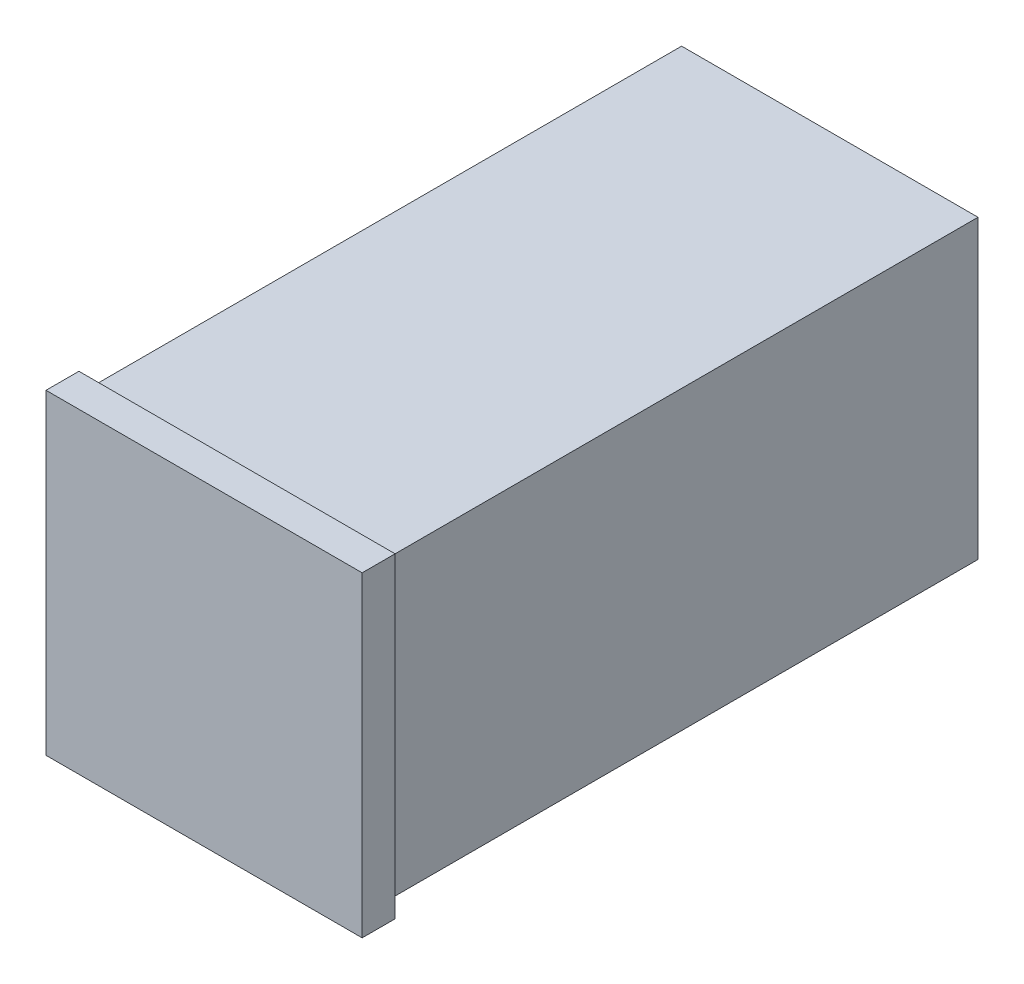
ISO-10303-21;
HEADER;
FILE_DESCRIPTION(('STEP AP214'),'2;1');
FILE_NAME('part.step','',(''),(''),'','','');
FILE_SCHEMA(('AUTOMOTIVE_DESIGN { 1 0 10303 214 1 1 1 1 }'));
ENDSEC;
DATA;
#1=APPLICATION_CONTEXT('core data for automotive mechanical design processes');
#2=APPLICATION_PROTOCOL_DEFINITION('international standard','automotive_design',2000,#1);
#3=PRODUCT_CONTEXT('',#1,'mechanical');
#4=PRODUCT('Part','Part','',(#3));
#5=PRODUCT_RELATED_PRODUCT_CATEGORY('part','',(#4));
#6=PRODUCT_DEFINITION_FORMATION('','',#4);
#7=PRODUCT_DEFINITION_CONTEXT('part definition',#1,'design');
#8=PRODUCT_DEFINITION('design','',#6,#7);
#9=PRODUCT_DEFINITION_SHAPE('','',#8);
#10=(LENGTH_UNIT() NAMED_UNIT(*) SI_UNIT(.MILLI.,.METRE.));
#11=(NAMED_UNIT(*) PLANE_ANGLE_UNIT() SI_UNIT($,.RADIAN.));
#12=(NAMED_UNIT(*) SI_UNIT($,.STERADIAN.) SOLID_ANGLE_UNIT());
#13=UNCERTAINTY_MEASURE_WITH_UNIT(LENGTH_MEASURE(1.E-05),#10,'distance_accuracy_value','');
#14=(GEOMETRIC_REPRESENTATION_CONTEXT(3) GLOBAL_UNCERTAINTY_ASSIGNED_CONTEXT((#13)) GLOBAL_UNIT_ASSIGNED_CONTEXT((#10,
#11,#12)) REPRESENTATION_CONTEXT('',''));
#15=CARTESIAN_POINT('',(0.,0.,0.));
#16=DIRECTION('',(0.,0.,1.));
#17=DIRECTION('',(1.,0.,0.));
#18=AXIS2_PLACEMENT_3D('',#15,#16,#17);
#19=CARTESIAN_POINT('',(0.,0.,-90.));
#20=DIRECTION('',(0.,-1.,0.));
#21=DIRECTION('',(0.,0.,-1.));
#22=AXIS2_PLACEMENT_3D('',#19,#20,#21);
#23=PLANE('',#22);
#24=DIRECTION('',(1.,0.,0.));
#25=VECTOR('',#24,1.);
#26=CARTESIAN_POINT('',(0.,0.,0.));
#27=LINE('',#26,#25);
#28=CARTESIAN_POINT('',(0.,0.,0.));
#29=VERTEX_POINT('',#28);
#30=CARTESIAN_POINT('',(45.,0.,0.));
#31=VERTEX_POINT('',#30);
#32=EDGE_CURVE('E109',#29,#31,#27,.T.);
#33=ORIENTED_EDGE('',*,*,#32,.F.);
#34=DIRECTION('',(0.,0.,1.));
#35=VECTOR('',#34,1.);
#36=CARTESIAN_POINT('',(0.,0.,-90.));
#37=LINE('',#36,#35);
#38=CARTESIAN_POINT('',(0.,0.,-90.));
#39=VERTEX_POINT('',#38);
#40=EDGE_CURVE('E12',#39,#29,#37,.T.);
#41=ORIENTED_EDGE('',*,*,#40,.F.);
#42=DIRECTION('',(1.,0.,0.));
#43=VECTOR('',#42,1.);
#44=CARTESIAN_POINT('',(0.,0.,-90.));
#45=LINE('',#44,#43);
#46=CARTESIAN_POINT('',(45.,0.,-90.));
#47=VERTEX_POINT('',#46);
#48=EDGE_CURVE('E104',#39,#47,#45,.T.);
#49=ORIENTED_EDGE('',*,*,#48,.T.);
#50=DIRECTION('',(0.,0.,1.));
#51=VECTOR('',#50,1.);
#52=CARTESIAN_POINT('',(45.,0.,-90.));
#53=LINE('',#52,#51);
#54=EDGE_CURVE('E47',#47,#31,#53,.T.);
#55=ORIENTED_EDGE('',*,*,#54,.T.);
#56=EDGE_LOOP('',(#33,#41,#49,#55));
#57=FACE_BOUND('',#56,.T.);
#58=ADVANCED_FACE('F44',(#57),#23,.T.);
#59=CARTESIAN_POINT('',(0.,0.,-90.));
#60=DIRECTION('',(1.,0.,0.));
#61=DIRECTION('',(0.,1.,0.));
#62=AXIS2_PLACEMENT_3D('',#59,#60,#61);
#63=PLANE('',#62);
#64=DIRECTION('',(0.,1.,0.));
#65=VECTOR('',#64,1.);
#66=CARTESIAN_POINT('',(0.,0.,0.));
#67=LINE('',#66,#65);
#68=CARTESIAN_POINT('',(0.,45.,0.));
#69=VERTEX_POINT('',#68);
#70=EDGE_CURVE('E77',#29,#69,#67,.T.);
#71=ORIENTED_EDGE('',*,*,#70,.T.);
#72=DIRECTION('',(0.,0.,1.));
#73=VECTOR('',#72,1.);
#74=CARTESIAN_POINT('',(0.,45.,-90.));
#75=LINE('',#74,#73);
#76=CARTESIAN_POINT('',(0.,45.,-90.));
#77=VERTEX_POINT('',#76);
#78=EDGE_CURVE('E53',#77,#69,#75,.T.);
#79=ORIENTED_EDGE('',*,*,#78,.F.);
#80=DIRECTION('',(0.,1.,0.));
#81=VECTOR('',#80,1.);
#82=CARTESIAN_POINT('',(0.,0.,-90.));
#83=LINE('',#82,#81);
#84=EDGE_CURVE('E94',#39,#77,#83,.T.);
#85=ORIENTED_EDGE('',*,*,#84,.F.);
#86=ORIENTED_EDGE('',*,*,#40,.T.);
#87=EDGE_LOOP('',(#71,#79,#85,#86));
#88=FACE_BOUND('',#87,.T.);
#89=ADVANCED_FACE('F119',(#88),#63,.F.);
#90=CARTESIAN_POINT('',(0.,45.,-90.));
#91=DIRECTION('',(0.,-1.,0.));
#92=DIRECTION('',(0.,0.,-1.));
#93=AXIS2_PLACEMENT_3D('',#90,#91,#92);
#94=PLANE('',#93);
#95=DIRECTION('',(1.,0.,0.));
#96=VECTOR('',#95,1.);
#97=CARTESIAN_POINT('',(0.,45.,0.));
#98=LINE('',#97,#96);
#99=CARTESIAN_POINT('',(45.,45.,0.));
#100=VERTEX_POINT('',#99);
#101=EDGE_CURVE('E101',#69,#100,#98,.T.);
#102=ORIENTED_EDGE('',*,*,#101,.T.);
#103=DIRECTION('',(0.,0.,1.));
#104=VECTOR('',#103,1.);
#105=CARTESIAN_POINT('',(45.,45.,-90.));
#106=LINE('',#105,#104);
#107=CARTESIAN_POINT('',(45.,45.,-90.));
#108=VERTEX_POINT('',#107);
#109=EDGE_CURVE('E98',#108,#100,#106,.T.);
#110=ORIENTED_EDGE('',*,*,#109,.F.);
#111=DIRECTION('',(1.,0.,0.));
#112=VECTOR('',#111,1.);
#113=CARTESIAN_POINT('',(0.,45.,-90.));
#114=LINE('',#113,#112);
#115=EDGE_CURVE('E89',#77,#108,#114,.T.);
#116=ORIENTED_EDGE('',*,*,#115,.F.);
#117=ORIENTED_EDGE('',*,*,#78,.T.);
#118=EDGE_LOOP('',(#102,#110,#116,#117));
#119=FACE_BOUND('',#118,.T.);
#120=ADVANCED_FACE('F99',(#119),#94,.F.);
#121=CARTESIAN_POINT('',(45.,0.,-90.));
#122=DIRECTION('',(1.,0.,0.));
#123=DIRECTION('',(0.,1.,0.));
#124=AXIS2_PLACEMENT_3D('',#121,#122,#123);
#125=PLANE('',#124);
#126=DIRECTION('',(0.,1.,0.));
#127=VECTOR('',#126,1.);
#128=CARTESIAN_POINT('',(45.,0.,0.));
#129=LINE('',#128,#127);
#130=EDGE_CURVE('E112',#31,#100,#129,.T.);
#131=ORIENTED_EDGE('',*,*,#130,.F.);
#132=ORIENTED_EDGE('',*,*,#54,.F.);
#133=DIRECTION('',(0.,1.,0.));
#134=VECTOR('',#133,1.);
#135=CARTESIAN_POINT('',(45.,0.,-90.));
#136=LINE('',#135,#134);
#137=EDGE_CURVE('E93',#47,#108,#136,.T.);
#138=ORIENTED_EDGE('',*,*,#137,.T.);
#139=ORIENTED_EDGE('',*,*,#109,.T.);
#140=EDGE_LOOP('',(#131,#132,#138,#139));
#141=FACE_BOUND('',#140,.T.);
#142=ADVANCED_FACE('F103',(#141),#125,.T.);
#143=CARTESIAN_POINT('',(0.,0.,-90.));
#144=DIRECTION('',(0.,0.,1.));
#145=DIRECTION('',(1.,0.,0.));
#146=AXIS2_PLACEMENT_3D('',#143,#144,#145);
#147=PLANE('',#146);
#148=ORIENTED_EDGE('',*,*,#48,.F.);
#149=ORIENTED_EDGE('',*,*,#84,.T.);
#150=ORIENTED_EDGE('',*,*,#115,.T.);
#151=ORIENTED_EDGE('',*,*,#137,.F.);
#152=EDGE_LOOP('',(#148,#149,#150,#151));
#153=FACE_BOUND('',#152,.T.);
#154=ADVANCED_FACE('F92',(#153),#147,.F.);
#155=CARTESIAN_POINT('',(0.,0.,0.));
#156=DIRECTION('',(0.,0.,1.));
#157=DIRECTION('',(1.,0.,0.));
#158=AXIS2_PLACEMENT_3D('',#155,#156,#157);
#159=PLANE('',#158);
#160=ORIENTED_EDGE('',*,*,#32,.T.);
#161=ORIENTED_EDGE('',*,*,#130,.T.);
#162=ORIENTED_EDGE('',*,*,#101,.F.);
#163=ORIENTED_EDGE('',*,*,#70,.F.);
#164=EDGE_LOOP('',(#160,#161,#162,#163));
#165=FACE_BOUND('',#164,.T.);
#166=ADVANCED_FACE('F117',(#165),#159,.T.);
#167=CLOSED_SHELL('',(#58,#89,#120,#142,#154,#166));
#168=MANIFOLD_SOLID_BREP('B2',#167);
#169=CARTESIAN_POINT('',(-1.5,0.,5.));
#170=DIRECTION('',(-1.,0.,0.));
#171=DIRECTION('',(0.,0.,1.));
#172=AXIS2_PLACEMENT_3D('',#169,#170,#171);
#173=PLANE('',#172);
#174=DIRECTION('',(0.,1.,0.));
#175=VECTOR('',#174,1.);
#176=CARTESIAN_POINT('',(-1.5,0.,0.));
#177=LINE('',#176,#175);
#178=CARTESIAN_POINT('',(-1.5,-1.5,0.));
#179=VERTEX_POINT('',#178);
#180=CARTESIAN_POINT('',(-1.5,46.5,0.));
#181=VERTEX_POINT('',#180);
#182=EDGE_CURVE('E230',#179,#181,#177,.T.);
#183=ORIENTED_EDGE('',*,*,#182,.F.);
#184=DIRECTION('',(0.,0.,-1.));
#185=VECTOR('',#184,1.);
#186=CARTESIAN_POINT('',(-1.5,-1.5,5.));
#187=LINE('',#186,#185);
#188=CARTESIAN_POINT('',(-1.5,-1.5,5.));
#189=VERTEX_POINT('',#188);
#190=EDGE_CURVE('E42',#189,#179,#187,.T.);
#191=ORIENTED_EDGE('',*,*,#190,.F.);
#192=DIRECTION('',(0.,1.,0.));
#193=VECTOR('',#192,1.);
#194=CARTESIAN_POINT('',(-1.5,0.,5.));
#195=LINE('',#194,#193);
#196=CARTESIAN_POINT('',(-1.5,46.5,5.));
#197=VERTEX_POINT('',#196);
#198=EDGE_CURVE('E215',#189,#197,#195,.T.);
#199=ORIENTED_EDGE('',*,*,#198,.T.);
#200=DIRECTION('',(0.,0.,-1.));
#201=VECTOR('',#200,1.);
#202=CARTESIAN_POINT('',(-1.5,46.5,5.));
#203=LINE('',#202,#201);
#204=EDGE_CURVE('E183',#197,#181,#203,.T.);
#205=ORIENTED_EDGE('',*,*,#204,.T.);
#206=EDGE_LOOP('',(#183,#191,#199,#205));
#207=FACE_BOUND('',#206,.T.);
#208=ADVANCED_FACE('F167',(#207),#173,.T.);
#209=CARTESIAN_POINT('',(0.,-1.5,5.));
#210=DIRECTION('',(0.,1.,0.));
#211=DIRECTION('',(0.,0.,1.));
#212=AXIS2_PLACEMENT_3D('',#209,#210,#211);
#213=PLANE('',#212);
#214=DIRECTION('',(1.,0.,0.));
#215=VECTOR('',#214,1.);
#216=CARTESIAN_POINT('',(0.,-1.5,0.));
#217=LINE('',#216,#215);
#218=CARTESIAN_POINT('',(46.5,-1.5,0.));
#219=VERTEX_POINT('',#218);
#220=EDGE_CURVE('E221',#179,#219,#217,.T.);
#221=ORIENTED_EDGE('',*,*,#220,.T.);
#222=DIRECTION('',(0.,0.,-1.));
#223=VECTOR('',#222,1.);
#224=CARTESIAN_POINT('',(46.5,-1.5,5.));
#225=LINE('',#224,#223);
#226=CARTESIAN_POINT('',(46.5,-1.5,5.));
#227=VERTEX_POINT('',#226);
#228=EDGE_CURVE('E175',#227,#219,#225,.T.);
#229=ORIENTED_EDGE('',*,*,#228,.F.);
#230=DIRECTION('',(1.,0.,0.));
#231=VECTOR('',#230,1.);
#232=CARTESIAN_POINT('',(0.,-1.5,5.));
#233=LINE('',#232,#231);
#234=EDGE_CURVE('E209',#189,#227,#233,.T.);
#235=ORIENTED_EDGE('',*,*,#234,.F.);
#236=ORIENTED_EDGE('',*,*,#190,.T.);
#237=EDGE_LOOP('',(#221,#229,#235,#236));
#238=FACE_BOUND('',#237,.T.);
#239=ADVANCED_FACE('F219',(#238),#213,.F.);
#240=CARTESIAN_POINT('',(46.5,0.,5.));
#241=DIRECTION('',(-1.,0.,0.));
#242=DIRECTION('',(0.,0.,1.));
#243=AXIS2_PLACEMENT_3D('',#240,#241,#242);
#244=PLANE('',#243);
#245=DIRECTION('',(0.,1.,0.));
#246=VECTOR('',#245,1.);
#247=CARTESIAN_POINT('',(46.5,0.,0.));
#248=LINE('',#247,#246);
#249=CARTESIAN_POINT('',(46.5,46.5,0.));
#250=VERTEX_POINT('',#249);
#251=EDGE_CURVE('E233',#219,#250,#248,.T.);
#252=ORIENTED_EDGE('',*,*,#251,.T.);
#253=DIRECTION('',(0.,0.,-1.));
#254=VECTOR('',#253,1.);
#255=CARTESIAN_POINT('',(46.5,46.5,5.));
#256=LINE('',#255,#254);
#257=CARTESIAN_POINT('',(46.5,46.5,5.));
#258=VERTEX_POINT('',#257);
#259=EDGE_CURVE('E197',#258,#250,#256,.T.);
#260=ORIENTED_EDGE('',*,*,#259,.F.);
#261=DIRECTION('',(0.,1.,0.));
#262=VECTOR('',#261,1.);
#263=CARTESIAN_POINT('',(46.5,0.,5.));
#264=LINE('',#263,#262);
#265=EDGE_CURVE('E214',#227,#258,#264,.T.);
#266=ORIENTED_EDGE('',*,*,#265,.F.);
#267=ORIENTED_EDGE('',*,*,#228,.T.);
#268=EDGE_LOOP('',(#252,#260,#266,#267));
#269=FACE_BOUND('',#268,.T.);
#270=ADVANCED_FACE('F224',(#269),#244,.F.);
#271=CARTESIAN_POINT('',(0.,46.5,5.));
#272=DIRECTION('',(0.,1.,0.));
#273=DIRECTION('',(0.,0.,1.));
#274=AXIS2_PLACEMENT_3D('',#271,#272,#273);
#275=PLANE('',#274);
#276=DIRECTION('',(1.,0.,0.));
#277=VECTOR('',#276,1.);
#278=CARTESIAN_POINT('',(0.,46.5,0.));
#279=LINE('',#278,#277);
#280=EDGE_CURVE('E235',#181,#250,#279,.T.);
#281=ORIENTED_EDGE('',*,*,#280,.F.);
#282=ORIENTED_EDGE('',*,*,#204,.F.);
#283=DIRECTION('',(1.,0.,0.));
#284=VECTOR('',#283,1.);
#285=CARTESIAN_POINT('',(0.,46.5,5.));
#286=LINE('',#285,#284);
#287=EDGE_CURVE('E225',#197,#258,#286,.T.);
#288=ORIENTED_EDGE('',*,*,#287,.T.);
#289=ORIENTED_EDGE('',*,*,#259,.T.);
#290=EDGE_LOOP('',(#281,#282,#288,#289));
#291=FACE_BOUND('',#290,.T.);
#292=ADVANCED_FACE('F240',(#291),#275,.T.);
#293=CARTESIAN_POINT('',(0.,0.,5.));
#294=DIRECTION('',(0.,0.,1.));
#295=DIRECTION('',(1.,0.,0.));
#296=AXIS2_PLACEMENT_3D('',#293,#294,#295);
#297=PLANE('',#296);
#298=ORIENTED_EDGE('',*,*,#198,.F.);
#299=ORIENTED_EDGE('',*,*,#234,.T.);
#300=ORIENTED_EDGE('',*,*,#265,.T.);
#301=ORIENTED_EDGE('',*,*,#287,.F.);
#302=EDGE_LOOP('',(#298,#299,#300,#301));
#303=FACE_BOUND('',#302,.T.);
#304=ADVANCED_FACE('F211',(#303),#297,.T.);
#305=CARTESIAN_POINT('',(0.,0.,0.));
#306=DIRECTION('',(0.,0.,1.));
#307=DIRECTION('',(1.,0.,0.));
#308=AXIS2_PLACEMENT_3D('',#305,#306,#307);
#309=PLANE('',#308);
#310=ORIENTED_EDGE('',*,*,#182,.T.);
#311=ORIENTED_EDGE('',*,*,#280,.T.);
#312=ORIENTED_EDGE('',*,*,#251,.F.);
#313=ORIENTED_EDGE('',*,*,#220,.F.);
#314=EDGE_LOOP('',(#310,#311,#312,#313));
#315=FACE_BOUND('',#314,.T.);
#316=ADVANCED_FACE('F247',(#315),#309,.F.);
#317=CLOSED_SHELL('',(#208,#239,#270,#292,#304,#316));
#318=MANIFOLD_SOLID_BREP('B6',#317);
#319=ADVANCED_BREP_SHAPE_REPRESENTATION('',(#18,#168,#318),#14);
#320=SHAPE_DEFINITION_REPRESENTATION(#9,#319);
ENDSEC;
END-ISO-10303-21;
